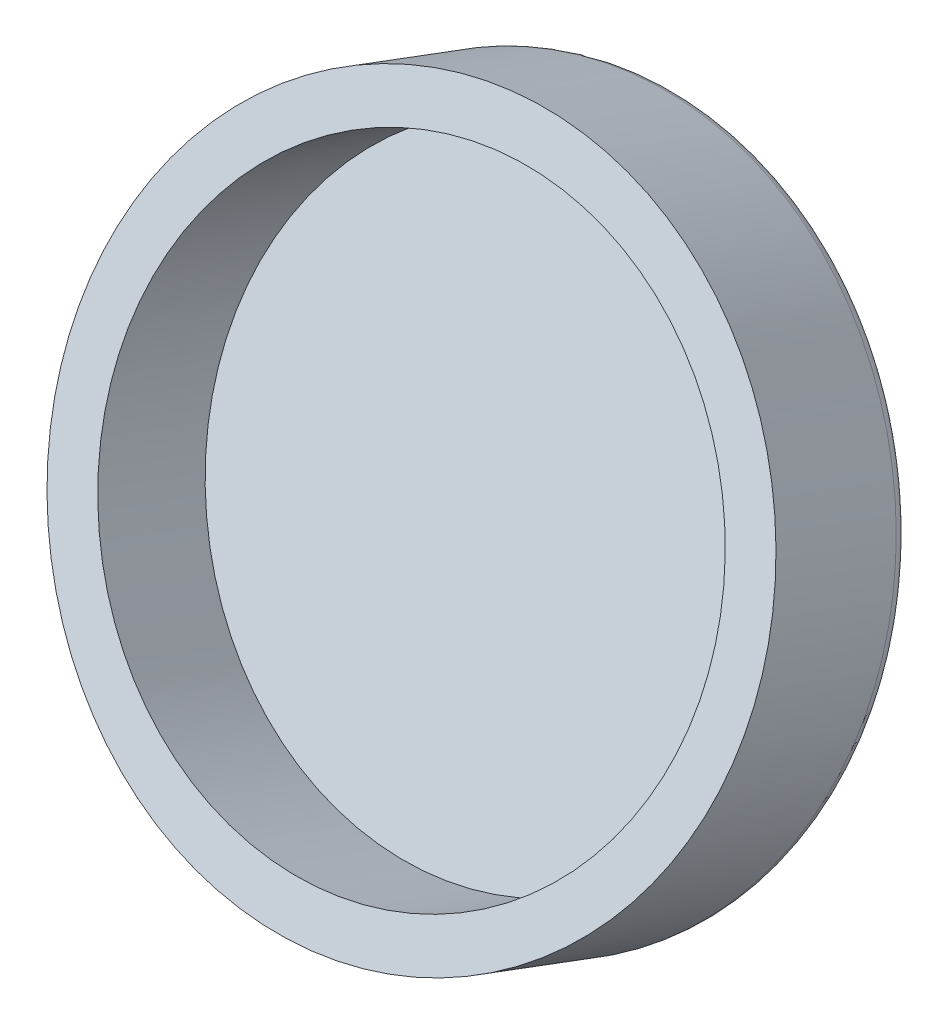
ISO-10303-21;
HEADER;
FILE_DESCRIPTION(('STEP AP214'),'2;1');
FILE_NAME('part.step','',(''),(''),'','','');
FILE_SCHEMA(('AUTOMOTIVE_DESIGN { 1 0 10303 214 1 1 1 1 }'));
ENDSEC;
DATA;
#1=APPLICATION_CONTEXT('core data for automotive mechanical design processes');
#2=APPLICATION_PROTOCOL_DEFINITION('international standard','automotive_design',2000,#1);
#3=PRODUCT_CONTEXT('',#1,'mechanical');
#4=PRODUCT('Part','Part','',(#3));
#5=PRODUCT_RELATED_PRODUCT_CATEGORY('part','',(#4));
#6=PRODUCT_DEFINITION_FORMATION('','',#4);
#7=PRODUCT_DEFINITION_CONTEXT('part definition',#1,'design');
#8=PRODUCT_DEFINITION('design','',#6,#7);
#9=PRODUCT_DEFINITION_SHAPE('','',#8);
#10=(LENGTH_UNIT() NAMED_UNIT(*) SI_UNIT(.MILLI.,.METRE.));
#11=(NAMED_UNIT(*) PLANE_ANGLE_UNIT() SI_UNIT($,.RADIAN.));
#12=(NAMED_UNIT(*) SI_UNIT($,.STERADIAN.) SOLID_ANGLE_UNIT());
#13=UNCERTAINTY_MEASURE_WITH_UNIT(LENGTH_MEASURE(1.E-05),#10,'distance_accuracy_value','');
#14=(GEOMETRIC_REPRESENTATION_CONTEXT(3) GLOBAL_UNCERTAINTY_ASSIGNED_CONTEXT((#13)) GLOBAL_UNIT_ASSIGNED_CONTEXT((#10,
#11,#12)) REPRESENTATION_CONTEXT('',''));
#15=CARTESIAN_POINT('',(0.,0.,0.));
#16=DIRECTION('',(0.,0.,1.));
#17=DIRECTION('',(1.,0.,0.));
#18=AXIS2_PLACEMENT_3D('',#15,#16,#17);
#19=CARTESIAN_POINT('',(-20.0355135737193,30.7154592546604,77.9234419706933));
#20=DIRECTION('',(-0.0620196065672677,-0.383020208529756,-0.921655623461965));
#21=DIRECTION('',(0.,0.923433296037534,-0.383758970930005));
#22=AXIS2_PLACEMENT_3D('',#19,#20,#21);
#23=CYLINDRICAL_SURFACE('',#22,17.);
#24=CARTESIAN_POINT('',(-20.5183814188655,27.7333677359144,70.7476811185946));
#25=DIRECTION('',(-0.0620196065672677,-0.383020208529756,-0.921655623461965));
#26=DIRECTION('',(0.,0.923433296037534,-0.383758970930005));
#27=AXIS2_PLACEMENT_3D('',#24,#25,#26);
#28=CIRCLE('',#27,17.);
#29=CARTESIAN_POINT('',(-20.5183814188655,43.4317337685525,64.2237786127845));
#30=VERTEX_POINT('',#29);
#31=EDGE_CURVE('E47',#30,#30,#28,.T.);
#32=ORIENTED_EDGE('',*,*,#31,.T.);
#33=EDGE_LOOP('',(#32));
#34=FACE_BOUND('',#33,.T.);
#35=CARTESIAN_POINT('',(-20.0470324089542,30.6443213207406,77.7522638569055));
#36=DIRECTION('',(-0.0620196065672677,-0.383020208529756,-0.921655623461965));
#37=DIRECTION('',(0.,0.923433296037534,-0.383758970930005));
#38=AXIS2_PLACEMENT_3D('',#35,#36,#37);
#39=CIRCLE('',#38,17.);
#40=CARTESIAN_POINT('',(-20.0470324089542,46.3426873533786,71.2283613510954));
#41=VERTEX_POINT('',#40);
#42=EDGE_CURVE('E10',#41,#41,#39,.T.);
#43=ORIENTED_EDGE('',*,*,#42,.F.);
#44=EDGE_LOOP('',(#43));
#45=FACE_BOUND('',#44,.T.);
#46=ADVANCED_FACE('F28',(#34,#45),#23,.F.);
#47=CARTESIAN_POINT('',(-0.33505251665247,30.1742598579642,76.6211622051061));
#48=DIRECTION('',(0.0620196065672677,0.383020208529756,0.921655623461965));
#49=DIRECTION('',(0.,-0.923433296037534,0.383758970930005));
#50=AXIS2_PLACEMENT_3D('',#47,#48,#49);
#51=PLANE('',#50);
#52=ORIENTED_EDGE('',*,*,#42,.T.);
#53=EDGE_LOOP('',(#52));
#54=FACE_BOUND('',#53,.T.);
#55=CARTESIAN_POINT('',(-20.0470324089542,30.6443213207406,77.7522638569055));
#56=DIRECTION('',(-0.0620196065672677,-0.383020208529756,-0.921655623461965));
#57=DIRECTION('',(0.,0.923433296037534,-0.383758970930005));
#58=AXIS2_PLACEMENT_3D('',#55,#56,#57);
#59=CIRCLE('',#58,19.75);
#60=CARTESIAN_POINT('',(-20.0470324089542,48.8821289174819,70.1730241810379));
#61=VERTEX_POINT('',#60);
#62=EDGE_CURVE('E34',#61,#61,#59,.T.);
#63=ORIENTED_EDGE('',*,*,#62,.F.);
#64=EDGE_LOOP('',(#63));
#65=FACE_BOUND('',#64,.T.);
#66=ADVANCED_FACE('F64',(#54,#65),#51,.T.);
#67=CARTESIAN_POINT('',(-20.0355135737193,30.7154592546604,77.9234419706933));
#68=DIRECTION('',(-0.0620196065672677,-0.383020208529756,-0.921655623461965));
#69=DIRECTION('',(0.,0.923433296037534,-0.383758970930005));
#70=AXIS2_PLACEMENT_3D('',#67,#68,#69);
#71=CYLINDRICAL_SURFACE('',#70,19.75);
#72=ORIENTED_EDGE('',*,*,#62,.T.);
#73=EDGE_LOOP('',(#72));
#74=FACE_BOUND('',#73,.T.);
#75=CARTESIAN_POINT('',(-20.5748869027066,27.3844016040443,69.9079692948491));
#76=DIRECTION('',(-0.0620196065672677,-0.383020208529756,-0.921655623461965));
#77=DIRECTION('',(0.,0.923433296037534,-0.383758970930005));
#78=AXIS2_PLACEMENT_3D('',#75,#76,#77);
#79=CIRCLE('',#78,19.75);
#80=CARTESIAN_POINT('',(-20.5748869027066,45.6222092007856,62.3287296189815));
#81=VERTEX_POINT('',#80);
#82=EDGE_CURVE('E38',#81,#81,#79,.T.);
#83=ORIENTED_EDGE('',*,*,#82,.F.);
#84=EDGE_LOOP('',(#83));
#85=FACE_BOUND('',#84,.T.);
#86=ADVANCED_FACE('F68',(#74,#85),#71,.T.);
#87=CARTESIAN_POINT('',(-20.5748869027066,27.3844016040443,69.9079692948491));
#88=DIRECTION('',(-0.0620196065672677,-0.383020208529756,-0.921655623461965));
#89=DIRECTION('',(0.,0.923433296037534,-0.383758970930005));
#90=AXIS2_PLACEMENT_3D('',#87,#88,#89);
#91=TOROIDAL_SURFACE('',#90,18.7499999999998,1.0000000000002);
#92=ORIENTED_EDGE('',*,*,#82,.T.);
#93=EDGE_LOOP('',(#92));
#94=FACE_BOUND('',#93,.T.);
#95=CARTESIAN_POINT('',(-20.6362186713432,27.0056293397082,68.9965354340175));
#96=DIRECTION('',(-0.0620196065672677,-0.383020208529756,-0.921655623461965));
#97=DIRECTION('',(0.,0.923433296037534,-0.383758970930005));
#98=AXIS2_PLACEMENT_3D('',#95,#96,#97);
#99=CIRCLE('',#98,18.6014796200662);
#100=CARTESIAN_POINT('',(-20.6362186713432,44.1828549764409,61.8580507572455));
#101=VERTEX_POINT('',#100);
#102=EDGE_CURVE('E42',#101,#101,#99,.T.);
#103=ORIENTED_EDGE('',*,*,#102,.F.);
#104=EDGE_LOOP('',(#103));
#105=FACE_BOUND('',#104,.T.);
#106=ADVANCED_FACE('F60',(#94,#105),#91,.T.);
#107=CARTESIAN_POINT('',(-20.6362186713432,27.0056293397082,68.9965354340175));
#108=DIRECTION('',(-0.0620196065672677,-0.383020208529756,-0.921655623461965));
#109=DIRECTION('',(0.,0.923433296037534,-0.383758970930005));
#110=AXIS2_PLACEMENT_3D('',#107,#108,#109);
#111=PLANE('',#110);
#112=ORIENTED_EDGE('',*,*,#102,.T.);
#113=EDGE_LOOP('',(#112));
#114=FACE_BOUND('',#113,.T.);
#115=ADVANCED_FACE('F55',(#114),#111,.T.);
#116=CARTESIAN_POINT('',(-3.5511075875171,27.3287578692209,69.7740746335014));
#117=DIRECTION('',(0.0620196065672677,0.383020208529756,0.921655623461965));
#118=DIRECTION('',(0.,-0.923433296037534,0.383758970930005));
#119=AXIS2_PLACEMENT_3D('',#116,#117,#118);
#120=PLANE('',#119);
#121=ORIENTED_EDGE('',*,*,#31,.F.);
#122=EDGE_LOOP('',(#121));
#123=FACE_BOUND('',#122,.T.);
#124=ADVANCED_FACE('F53',(#123),#120,.T.);
#125=CLOSED_SHELL('',(#46,#66,#86,#106,#115,#124));
#126=MANIFOLD_SOLID_BREP('B2',#125);
#127=ADVANCED_BREP_SHAPE_REPRESENTATION('',(#18,#126),#14);
#128=SHAPE_DEFINITION_REPRESENTATION(#9,#127);
ENDSEC;
END-ISO-10303-21;
